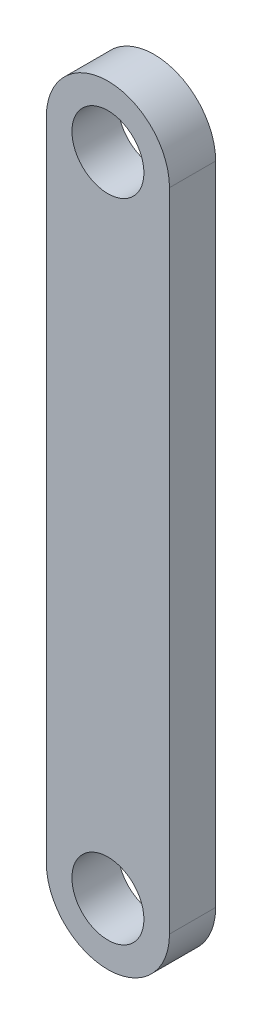
ISO-10303-21;
HEADER;
FILE_DESCRIPTION(('STEP AP214'),'2;1');
FILE_NAME('part.step','',(''),(''),'','','');
FILE_SCHEMA(('AUTOMOTIVE_DESIGN { 1 0 10303 214 1 1 1 1 }'));
ENDSEC;
DATA;
#1=APPLICATION_CONTEXT('core data for automotive mechanical design processes');
#2=APPLICATION_PROTOCOL_DEFINITION('international standard','automotive_design',2000,#1);
#3=PRODUCT_CONTEXT('',#1,'mechanical');
#4=PRODUCT('Part','Part','',(#3));
#5=PRODUCT_RELATED_PRODUCT_CATEGORY('part','',(#4));
#6=PRODUCT_DEFINITION_FORMATION('','',#4);
#7=PRODUCT_DEFINITION_CONTEXT('part definition',#1,'design');
#8=PRODUCT_DEFINITION('design','',#6,#7);
#9=PRODUCT_DEFINITION_SHAPE('','',#8);
#10=(LENGTH_UNIT() NAMED_UNIT(*) SI_UNIT(.MILLI.,.METRE.));
#11=(NAMED_UNIT(*) PLANE_ANGLE_UNIT() SI_UNIT($,.RADIAN.));
#12=(NAMED_UNIT(*) SI_UNIT($,.STERADIAN.) SOLID_ANGLE_UNIT());
#13=UNCERTAINTY_MEASURE_WITH_UNIT(LENGTH_MEASURE(1.E-05),#10,'distance_accuracy_value','');
#14=(GEOMETRIC_REPRESENTATION_CONTEXT(3) GLOBAL_UNCERTAINTY_ASSIGNED_CONTEXT((#13)) GLOBAL_UNIT_ASSIGNED_CONTEXT((#10,
#11,#12)) REPRESENTATION_CONTEXT('',''));
#15=CARTESIAN_POINT('',(0.,0.,0.));
#16=DIRECTION('',(0.,0.,1.));
#17=DIRECTION('',(1.,0.,0.));
#18=AXIS2_PLACEMENT_3D('',#15,#16,#17);
#19=CARTESIAN_POINT('',(0.,42.,3.));
#20=DIRECTION('',(0.,0.,1.));
#21=DIRECTION('',(1.,0.,0.));
#22=AXIS2_PLACEMENT_3D('',#19,#20,#21);
#23=PLANE('',#22);
#24=CARTESIAN_POINT('',(0.,0.,3.));
#25=DIRECTION('',(0.,0.,1.));
#26=DIRECTION('',(1.,0.,0.));
#27=AXIS2_PLACEMENT_3D('',#24,#25,#26);
#28=CIRCLE('',#27,2.34);
#29=CARTESIAN_POINT('',(2.34,0.,3.));
#30=VERTEX_POINT('',#29);
#31=EDGE_CURVE('E108',#30,#30,#28,.T.);
#32=ORIENTED_EDGE('',*,*,#31,.F.);
#33=EDGE_LOOP('',(#32));
#34=FACE_BOUND('',#33,.T.);
#35=CARTESIAN_POINT('',(0.,42.,3.));
#36=DIRECTION('',(0.,0.,1.));
#37=DIRECTION('',(1.,0.,0.));
#38=AXIS2_PLACEMENT_3D('',#35,#36,#37);
#39=CIRCLE('',#38,4.);
#40=CARTESIAN_POINT('',(4.,42.,3.));
#41=VERTEX_POINT('',#40);
#42=CARTESIAN_POINT('',(-4.,42.,3.));
#43=VERTEX_POINT('',#42);
#44=EDGE_CURVE('E93',#41,#43,#39,.T.);
#45=ORIENTED_EDGE('',*,*,#44,.T.);
#46=DIRECTION('',(0.,-1.,0.));
#47=VECTOR('',#46,1.);
#48=CARTESIAN_POINT('',(-4.,42.,3.));
#49=LINE('',#48,#47);
#50=CARTESIAN_POINT('',(-4.,0.,3.));
#51=VERTEX_POINT('',#50);
#52=EDGE_CURVE('E88',#43,#51,#49,.T.);
#53=ORIENTED_EDGE('',*,*,#52,.T.);
#54=CARTESIAN_POINT('',(0.,0.,3.));
#55=DIRECTION('',(0.,0.,1.));
#56=DIRECTION('',(1.,0.,0.));
#57=AXIS2_PLACEMENT_3D('',#54,#55,#56);
#58=CIRCLE('',#57,4.);
#59=CARTESIAN_POINT('',(3.99999999999999,0.,3.));
#60=VERTEX_POINT('',#59);
#61=EDGE_CURVE('E91',#51,#60,#58,.T.);
#62=ORIENTED_EDGE('',*,*,#61,.T.);
#63=DIRECTION('',(0.,1.,0.));
#64=VECTOR('',#63,1.);
#65=CARTESIAN_POINT('',(4.,42.,3.));
#66=LINE('',#65,#64);
#67=EDGE_CURVE('E58',#60,#41,#66,.T.);
#68=ORIENTED_EDGE('',*,*,#67,.T.);
#69=EDGE_LOOP('',(#45,#53,#62,#68));
#70=FACE_BOUND('',#69,.T.);
#71=CARTESIAN_POINT('',(0.,42.,3.));
#72=DIRECTION('',(0.,0.,1.));
#73=DIRECTION('',(1.,0.,0.));
#74=AXIS2_PLACEMENT_3D('',#71,#72,#73);
#75=CIRCLE('',#74,2.34);
#76=CARTESIAN_POINT('',(2.34,42.,3.));
#77=VERTEX_POINT('',#76);
#78=EDGE_CURVE('E123',#77,#77,#75,.T.);
#79=ORIENTED_EDGE('',*,*,#78,.F.);
#80=EDGE_LOOP('',(#79));
#81=FACE_BOUND('',#80,.T.);
#82=ADVANCED_FACE('F41',(#34,#70,#81),#23,.T.);
#83=CARTESIAN_POINT('',(0.,42.,0.));
#84=DIRECTION('',(0.,0.,1.));
#85=DIRECTION('',(1.,0.,0.));
#86=AXIS2_PLACEMENT_3D('',#83,#84,#85);
#87=PLANE('',#86);
#88=CARTESIAN_POINT('',(0.,42.,0.));
#89=DIRECTION('',(0.,0.,1.));
#90=DIRECTION('',(1.,0.,0.));
#91=AXIS2_PLACEMENT_3D('',#88,#89,#90);
#92=CIRCLE('',#91,4.);
#93=CARTESIAN_POINT('',(4.,42.,0.));
#94=VERTEX_POINT('',#93);
#95=CARTESIAN_POINT('',(-4.,42.,0.));
#96=VERTEX_POINT('',#95);
#97=EDGE_CURVE('E105',#94,#96,#92,.T.);
#98=ORIENTED_EDGE('',*,*,#97,.F.);
#99=DIRECTION('',(0.,1.,0.));
#100=VECTOR('',#99,1.);
#101=CARTESIAN_POINT('',(4.,42.,0.));
#102=LINE('',#101,#100);
#103=CARTESIAN_POINT('',(3.99999999999999,0.,0.));
#104=VERTEX_POINT('',#103);
#105=EDGE_CURVE('E81',#104,#94,#102,.T.);
#106=ORIENTED_EDGE('',*,*,#105,.F.);
#107=CARTESIAN_POINT('',(0.,0.,0.));
#108=DIRECTION('',(0.,0.,1.));
#109=DIRECTION('',(1.,0.,0.));
#110=AXIS2_PLACEMENT_3D('',#107,#108,#109);
#111=CIRCLE('',#110,4.);
#112=CARTESIAN_POINT('',(-4.,0.,0.));
#113=VERTEX_POINT('',#112);
#114=EDGE_CURVE('E75',#113,#104,#111,.T.);
#115=ORIENTED_EDGE('',*,*,#114,.F.);
#116=DIRECTION('',(0.,-1.,0.));
#117=VECTOR('',#116,1.);
#118=CARTESIAN_POINT('',(-4.,42.,0.));
#119=LINE('',#118,#117);
#120=EDGE_CURVE('E97',#96,#113,#119,.T.);
#121=ORIENTED_EDGE('',*,*,#120,.F.);
#122=EDGE_LOOP('',(#98,#106,#115,#121));
#123=FACE_BOUND('',#122,.T.);
#124=CARTESIAN_POINT('',(0.,0.,0.));
#125=DIRECTION('',(0.,0.,1.));
#126=DIRECTION('',(1.,0.,0.));
#127=AXIS2_PLACEMENT_3D('',#124,#125,#126);
#128=CIRCLE('',#127,2.34);
#129=CARTESIAN_POINT('',(2.34,0.,0.));
#130=VERTEX_POINT('',#129);
#131=EDGE_CURVE('E120',#130,#130,#128,.T.);
#132=ORIENTED_EDGE('',*,*,#131,.T.);
#133=EDGE_LOOP('',(#132));
#134=FACE_BOUND('',#133,.T.);
#135=CARTESIAN_POINT('',(0.,42.,0.));
#136=DIRECTION('',(0.,0.,1.));
#137=DIRECTION('',(1.,0.,0.));
#138=AXIS2_PLACEMENT_3D('',#135,#136,#137);
#139=CIRCLE('',#138,2.34);
#140=CARTESIAN_POINT('',(2.34,42.,0.));
#141=VERTEX_POINT('',#140);
#142=EDGE_CURVE('E126',#141,#141,#139,.T.);
#143=ORIENTED_EDGE('',*,*,#142,.T.);
#144=EDGE_LOOP('',(#143));
#145=FACE_BOUND('',#144,.T.);
#146=ADVANCED_FACE('F116',(#123,#134,#145),#87,.F.);
#147=CARTESIAN_POINT('',(0.,42.,3.));
#148=DIRECTION('',(0.,0.,-1.));
#149=DIRECTION('',(-1.,0.,0.));
#150=AXIS2_PLACEMENT_3D('',#147,#148,#149);
#151=CYLINDRICAL_SURFACE('',#150,4.);
#152=ORIENTED_EDGE('',*,*,#97,.T.);
#153=DIRECTION('',(0.,0.,-1.));
#154=VECTOR('',#153,1.);
#155=CARTESIAN_POINT('',(-4.,42.,3.));
#156=LINE('',#155,#154);
#157=EDGE_CURVE('E11',#43,#96,#156,.T.);
#158=ORIENTED_EDGE('',*,*,#157,.F.);
#159=ORIENTED_EDGE('',*,*,#44,.F.);
#160=DIRECTION('',(0.,0.,-1.));
#161=VECTOR('',#160,1.);
#162=CARTESIAN_POINT('',(4.,42.,3.));
#163=LINE('',#162,#161);
#164=EDGE_CURVE('E101',#41,#94,#163,.T.);
#165=ORIENTED_EDGE('',*,*,#164,.T.);
#166=EDGE_LOOP('',(#152,#158,#159,#165));
#167=FACE_BOUND('',#166,.T.);
#168=ADVANCED_FACE('F43',(#167),#151,.T.);
#169=CARTESIAN_POINT('',(-4.,42.,3.));
#170=DIRECTION('',(1.,0.,0.));
#171=DIRECTION('',(0.,1.,0.));
#172=AXIS2_PLACEMENT_3D('',#169,#170,#171);
#173=PLANE('',#172);
#174=ORIENTED_EDGE('',*,*,#120,.T.);
#175=DIRECTION('',(0.,0.,-1.));
#176=VECTOR('',#175,1.);
#177=CARTESIAN_POINT('',(-4.,0.,3.));
#178=LINE('',#177,#176);
#179=EDGE_CURVE('E50',#51,#113,#178,.T.);
#180=ORIENTED_EDGE('',*,*,#179,.F.);
#181=ORIENTED_EDGE('',*,*,#52,.F.);
#182=ORIENTED_EDGE('',*,*,#157,.T.);
#183=EDGE_LOOP('',(#174,#180,#181,#182));
#184=FACE_BOUND('',#183,.T.);
#185=ADVANCED_FACE('F96',(#184),#173,.F.);
#186=CARTESIAN_POINT('',(0.,0.,3.));
#187=DIRECTION('',(0.,0.,-1.));
#188=DIRECTION('',(-1.,0.,0.));
#189=AXIS2_PLACEMENT_3D('',#186,#187,#188);
#190=CYLINDRICAL_SURFACE('',#189,4.);
#191=ORIENTED_EDGE('',*,*,#114,.T.);
#192=DIRECTION('',(0.,0.,-1.));
#193=VECTOR('',#192,1.);
#194=CARTESIAN_POINT('',(3.99999999999999,0.,3.));
#195=LINE('',#194,#193);
#196=EDGE_CURVE('E98',#60,#104,#195,.T.);
#197=ORIENTED_EDGE('',*,*,#196,.F.);
#198=ORIENTED_EDGE('',*,*,#61,.F.);
#199=ORIENTED_EDGE('',*,*,#179,.T.);
#200=EDGE_LOOP('',(#191,#197,#198,#199));
#201=FACE_BOUND('',#200,.T.);
#202=ADVANCED_FACE('F99',(#201),#190,.T.);
#203=CARTESIAN_POINT('',(4.,42.,3.));
#204=DIRECTION('',(-1.,0.,0.));
#205=DIRECTION('',(0.,-1.,0.));
#206=AXIS2_PLACEMENT_3D('',#203,#204,#205);
#207=PLANE('',#206);
#208=ORIENTED_EDGE('',*,*,#105,.T.);
#209=ORIENTED_EDGE('',*,*,#164,.F.);
#210=ORIENTED_EDGE('',*,*,#67,.F.);
#211=ORIENTED_EDGE('',*,*,#196,.T.);
#212=EDGE_LOOP('',(#208,#209,#210,#211));
#213=FACE_BOUND('',#212,.T.);
#214=ADVANCED_FACE('F113',(#213),#207,.F.);
#215=CARTESIAN_POINT('',(0.,0.,3.));
#216=DIRECTION('',(0.,0.,-1.));
#217=DIRECTION('',(-1.,0.,0.));
#218=AXIS2_PLACEMENT_3D('',#215,#216,#217);
#219=CYLINDRICAL_SURFACE('',#218,2.34);
#220=ORIENTED_EDGE('',*,*,#31,.T.);
#221=EDGE_LOOP('',(#220));
#222=FACE_BOUND('',#221,.T.);
#223=ORIENTED_EDGE('',*,*,#131,.F.);
#224=EDGE_LOOP('',(#223));
#225=FACE_BOUND('',#224,.T.);
#226=ADVANCED_FACE('F143',(#222,#225),#219,.F.);
#227=CARTESIAN_POINT('',(0.,42.,3.));
#228=DIRECTION('',(0.,0.,-1.));
#229=DIRECTION('',(-1.,0.,0.));
#230=AXIS2_PLACEMENT_3D('',#227,#228,#229);
#231=CYLINDRICAL_SURFACE('',#230,2.34);
#232=ORIENTED_EDGE('',*,*,#78,.T.);
#233=EDGE_LOOP('',(#232));
#234=FACE_BOUND('',#233,.T.);
#235=ORIENTED_EDGE('',*,*,#142,.F.);
#236=EDGE_LOOP('',(#235));
#237=FACE_BOUND('',#236,.T.);
#238=ADVANCED_FACE('F132',(#234,#237),#231,.F.);
#239=CLOSED_SHELL('',(#82,#146,#168,#185,#202,#214,#226,#238));
#240=MANIFOLD_SOLID_BREP('B2',#239);
#241=ADVANCED_BREP_SHAPE_REPRESENTATION('',(#18,#240),#14);
#242=SHAPE_DEFINITION_REPRESENTATION(#9,#241);
ENDSEC;
END-ISO-10303-21;
